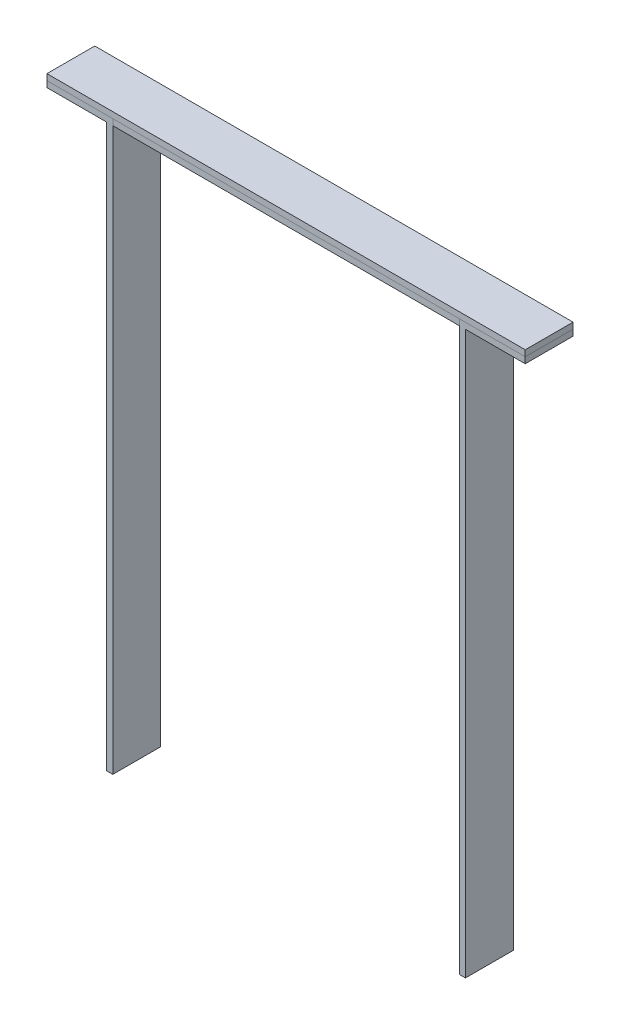
ISO-10303-21;
HEADER;
FILE_DESCRIPTION(('STEP AP214'),'2;1');
FILE_NAME('part.step','',(''),(''),'','','');
FILE_SCHEMA(('AUTOMOTIVE_DESIGN { 1 0 10303 214 1 1 1 1 }'));
ENDSEC;
DATA;
#1=APPLICATION_CONTEXT('core data for automotive mechanical design processes');
#2=APPLICATION_PROTOCOL_DEFINITION('international standard','automotive_design',2000,#1);
#3=PRODUCT_CONTEXT('',#1,'mechanical');
#4=PRODUCT('Part','Part','',(#3));
#5=PRODUCT_RELATED_PRODUCT_CATEGORY('part','',(#4));
#6=PRODUCT_DEFINITION_FORMATION('','',#4);
#7=PRODUCT_DEFINITION_CONTEXT('part definition',#1,'design');
#8=PRODUCT_DEFINITION('design','',#6,#7);
#9=PRODUCT_DEFINITION_SHAPE('','',#8);
#10=(LENGTH_UNIT() NAMED_UNIT(*) SI_UNIT(.MILLI.,.METRE.));
#11=(NAMED_UNIT(*) PLANE_ANGLE_UNIT() SI_UNIT($,.RADIAN.));
#12=(NAMED_UNIT(*) SI_UNIT($,.STERADIAN.) SOLID_ANGLE_UNIT());
#13=UNCERTAINTY_MEASURE_WITH_UNIT(LENGTH_MEASURE(1.E-05),#10,'distance_accuracy_value','');
#14=(GEOMETRIC_REPRESENTATION_CONTEXT(3) GLOBAL_UNCERTAINTY_ASSIGNED_CONTEXT((#13)) GLOBAL_UNIT_ASSIGNED_CONTEXT((#10,
#11,#12)) REPRESENTATION_CONTEXT('',''));
#15=CARTESIAN_POINT('',(0.,0.,0.));
#16=DIRECTION('',(0.,0.,1.));
#17=DIRECTION('',(1.,0.,0.));
#18=AXIS2_PLACEMENT_3D('',#15,#16,#17);
#19=CARTESIAN_POINT('',(0.,118.73,10.));
#20=DIRECTION('',(0.,-1.,0.));
#21=DIRECTION('',(0.,0.,-1.));
#22=AXIS2_PLACEMENT_3D('',#19,#20,#21);
#23=PLANE('',#22);
#24=DIRECTION('',(-1.,0.,0.));
#25=VECTOR('',#24,1.);
#26=CARTESIAN_POINT('',(0.,118.73,0.));
#27=LINE('',#26,#25);
#28=CARTESIAN_POINT('',(87.5,118.73,0.));
#29=VERTEX_POINT('',#28);
#30=CARTESIAN_POINT('',(-12.5,118.73,0.));
#31=VERTEX_POINT('',#30);
#32=EDGE_CURVE('E113',#29,#31,#27,.T.);
#33=ORIENTED_EDGE('',*,*,#32,.F.);
#34=DIRECTION('',(0.,0.,-1.));
#35=VECTOR('',#34,1.);
#36=CARTESIAN_POINT('',(87.5,118.73,10.));
#37=LINE('',#36,#35);
#38=CARTESIAN_POINT('',(87.5,118.73,10.));
#39=VERTEX_POINT('',#38);
#40=EDGE_CURVE('E12',#39,#29,#37,.T.);
#41=ORIENTED_EDGE('',*,*,#40,.F.);
#42=DIRECTION('',(-1.,0.,0.));
#43=VECTOR('',#42,1.);
#44=CARTESIAN_POINT('',(0.,118.73,10.));
#45=LINE('',#44,#43);
#46=CARTESIAN_POINT('',(-12.5,118.73,10.));
#47=VERTEX_POINT('',#46);
#48=EDGE_CURVE('E105',#39,#47,#45,.T.);
#49=ORIENTED_EDGE('',*,*,#48,.T.);
#50=DIRECTION('',(0.,0.,-1.));
#51=VECTOR('',#50,1.);
#52=CARTESIAN_POINT('',(-12.5,118.73,10.));
#53=LINE('',#52,#51);
#54=EDGE_CURVE('E66',#47,#31,#53,.T.);
#55=ORIENTED_EDGE('',*,*,#54,.T.);
#56=EDGE_LOOP('',(#33,#41,#49,#55));
#57=FACE_BOUND('',#56,.T.);
#58=ADVANCED_FACE('F50',(#57),#23,.T.);
#59=CARTESIAN_POINT('',(87.5,0.,10.));
#60=DIRECTION('',(1.,0.,0.));
#61=DIRECTION('',(0.,0.,-1.));
#62=AXIS2_PLACEMENT_3D('',#59,#60,#61);
#63=PLANE('',#62);
#64=DIRECTION('',(0.,-1.,0.));
#65=VECTOR('',#64,1.);
#66=CARTESIAN_POINT('',(87.5,0.,0.));
#67=LINE('',#66,#65);
#68=CARTESIAN_POINT('',(87.5,120.,0.));
#69=VERTEX_POINT('',#68);
#70=EDGE_CURVE('E96',#69,#29,#67,.T.);
#71=ORIENTED_EDGE('',*,*,#70,.F.);
#72=DIRECTION('',(0.,0.,-1.));
#73=VECTOR('',#72,1.);
#74=CARTESIAN_POINT('',(87.5,120.,10.));
#75=LINE('',#74,#73);
#76=CARTESIAN_POINT('',(87.5,120.,10.));
#77=VERTEX_POINT('',#76);
#78=EDGE_CURVE('E58',#77,#69,#75,.T.);
#79=ORIENTED_EDGE('',*,*,#78,.F.);
#80=DIRECTION('',(0.,-1.,0.));
#81=VECTOR('',#80,1.);
#82=CARTESIAN_POINT('',(87.5,0.,10.));
#83=LINE('',#82,#81);
#84=EDGE_CURVE('E94',#77,#39,#83,.T.);
#85=ORIENTED_EDGE('',*,*,#84,.T.);
#86=ORIENTED_EDGE('',*,*,#40,.T.);
#87=EDGE_LOOP('',(#71,#79,#85,#86));
#88=FACE_BOUND('',#87,.T.);
#89=ADVANCED_FACE('F93',(#88),#63,.T.);
#90=CARTESIAN_POINT('',(0.,120.,10.));
#91=DIRECTION('',(0.,1.,0.));
#92=DIRECTION('',(0.,0.,1.));
#93=AXIS2_PLACEMENT_3D('',#90,#91,#92);
#94=PLANE('',#93);
#95=DIRECTION('',(1.,0.,0.));
#96=VECTOR('',#95,1.);
#97=CARTESIAN_POINT('',(0.,120.,0.));
#98=LINE('',#97,#96);
#99=CARTESIAN_POINT('',(-12.5,120.,0.));
#100=VERTEX_POINT('',#99);
#101=EDGE_CURVE('E116',#100,#69,#98,.T.);
#102=ORIENTED_EDGE('',*,*,#101,.F.);
#103=DIRECTION('',(0.,0.,-1.));
#104=VECTOR('',#103,1.);
#105=CARTESIAN_POINT('',(-12.5,120.,10.));
#106=LINE('',#105,#104);
#107=CARTESIAN_POINT('',(-12.5,120.,10.));
#108=VERTEX_POINT('',#107);
#109=EDGE_CURVE('E79',#108,#100,#106,.T.);
#110=ORIENTED_EDGE('',*,*,#109,.F.);
#111=DIRECTION('',(1.,0.,0.));
#112=VECTOR('',#111,1.);
#113=CARTESIAN_POINT('',(0.,120.,10.));
#114=LINE('',#113,#112);
#115=EDGE_CURVE('E104',#108,#77,#114,.T.);
#116=ORIENTED_EDGE('',*,*,#115,.T.);
#117=ORIENTED_EDGE('',*,*,#78,.T.);
#118=EDGE_LOOP('',(#102,#110,#116,#117));
#119=FACE_BOUND('',#118,.T.);
#120=ADVANCED_FACE('F107',(#119),#94,.T.);
#121=CARTESIAN_POINT('',(-12.5,0.,10.));
#122=DIRECTION('',(-1.,0.,0.));
#123=DIRECTION('',(0.,0.,1.));
#124=AXIS2_PLACEMENT_3D('',#121,#122,#123);
#125=PLANE('',#124);
#126=DIRECTION('',(0.,1.,0.));
#127=VECTOR('',#126,1.);
#128=CARTESIAN_POINT('',(-12.5,0.,0.));
#129=LINE('',#128,#127);
#130=EDGE_CURVE('E118',#31,#100,#129,.T.);
#131=ORIENTED_EDGE('',*,*,#130,.F.);
#132=ORIENTED_EDGE('',*,*,#54,.F.);
#133=DIRECTION('',(0.,1.,0.));
#134=VECTOR('',#133,1.);
#135=CARTESIAN_POINT('',(-12.5,0.,10.));
#136=LINE('',#135,#134);
#137=EDGE_CURVE('E108',#47,#108,#136,.T.);
#138=ORIENTED_EDGE('',*,*,#137,.T.);
#139=ORIENTED_EDGE('',*,*,#109,.T.);
#140=EDGE_LOOP('',(#131,#132,#138,#139));
#141=FACE_BOUND('',#140,.T.);
#142=ADVANCED_FACE('F123',(#141),#125,.T.);
#143=CARTESIAN_POINT('',(0.,0.,10.));
#144=DIRECTION('',(0.,0.,1.));
#145=DIRECTION('',(1.,0.,0.));
#146=AXIS2_PLACEMENT_3D('',#143,#144,#145);
#147=PLANE('',#146);
#148=ORIENTED_EDGE('',*,*,#48,.F.);
#149=ORIENTED_EDGE('',*,*,#84,.F.);
#150=ORIENTED_EDGE('',*,*,#115,.F.);
#151=ORIENTED_EDGE('',*,*,#137,.F.);
#152=EDGE_LOOP('',(#148,#149,#150,#151));
#153=FACE_BOUND('',#152,.T.);
#154=ADVANCED_FACE('F102',(#153),#147,.T.);
#155=CARTESIAN_POINT('',(0.,0.,0.));
#156=DIRECTION('',(0.,0.,1.));
#157=DIRECTION('',(1.,0.,0.));
#158=AXIS2_PLACEMENT_3D('',#155,#156,#157);
#159=PLANE('',#158);
#160=ORIENTED_EDGE('',*,*,#32,.T.);
#161=ORIENTED_EDGE('',*,*,#130,.T.);
#162=ORIENTED_EDGE('',*,*,#101,.T.);
#163=ORIENTED_EDGE('',*,*,#70,.T.);
#164=EDGE_LOOP('',(#160,#161,#162,#163));
#165=FACE_BOUND('',#164,.T.);
#166=ADVANCED_FACE('F130',(#165),#159,.F.);
#167=CLOSED_SHELL('',(#58,#89,#120,#142,#154,#166));
#168=MANIFOLD_SOLID_BREP('B2',#167);
#169=CARTESIAN_POINT('',(1.27,0.,10.));
#170=DIRECTION('',(1.,0.,0.));
#171=DIRECTION('',(0.,1.,0.));
#172=AXIS2_PLACEMENT_3D('',#169,#170,#171);
#173=PLANE('',#172);
#174=DIRECTION('',(0.,-1.,0.));
#175=VECTOR('',#174,1.);
#176=CARTESIAN_POINT('',(1.27,0.,0.));
#177=LINE('',#176,#175);
#178=CARTESIAN_POINT('',(1.26999999999999,118.73,0.));
#179=VERTEX_POINT('',#178);
#180=CARTESIAN_POINT('',(1.26999999999999,117.46,0.));
#181=VERTEX_POINT('',#180);
#182=EDGE_CURVE('E256',#179,#181,#177,.T.);
#183=ORIENTED_EDGE('',*,*,#182,.T.);
#184=DIRECTION('',(0.,0.,-1.));
#185=VECTOR('',#184,1.);
#186=CARTESIAN_POINT('',(1.26999999999999,117.46,10.));
#187=LINE('',#186,#185);
#188=CARTESIAN_POINT('',(1.26999999999999,117.46,10.));
#189=VERTEX_POINT('',#188);
#190=EDGE_CURVE('E48',#189,#181,#187,.T.);
#191=ORIENTED_EDGE('',*,*,#190,.F.);
#192=DIRECTION('',(0.,-1.,0.));
#193=VECTOR('',#192,1.);
#194=CARTESIAN_POINT('',(1.27,0.,10.));
#195=LINE('',#194,#193);
#196=CARTESIAN_POINT('',(1.26999999999999,118.73,10.));
#197=VERTEX_POINT('',#196);
#198=EDGE_CURVE('E244',#197,#189,#195,.T.);
#199=ORIENTED_EDGE('',*,*,#198,.F.);
#200=DIRECTION('',(0.,0.,-1.));
#201=VECTOR('',#200,1.);
#202=CARTESIAN_POINT('',(1.26999999999999,118.73,10.));
#203=LINE('',#202,#201);
#204=EDGE_CURVE('E252',#197,#179,#203,.T.);
#205=ORIENTED_EDGE('',*,*,#204,.T.);
#206=EDGE_LOOP('',(#183,#191,#199,#205));
#207=FACE_BOUND('',#206,.T.);
#208=ADVANCED_FACE('F193',(#207),#173,.F.);
#209=CARTESIAN_POINT('',(0.,117.46,10.));
#210=DIRECTION('',(0.,1.,0.));
#211=DIRECTION('',(0.,0.,1.));
#212=AXIS2_PLACEMENT_3D('',#209,#210,#211);
#213=PLANE('',#212);
#214=DIRECTION('',(1.,0.,0.));
#215=VECTOR('',#214,1.);
#216=CARTESIAN_POINT('',(0.,117.46,0.));
#217=LINE('',#216,#215);
#218=CARTESIAN_POINT('',(73.73,117.46,0.));
#219=VERTEX_POINT('',#218);
#220=EDGE_CURVE('E248',#181,#219,#217,.T.);
#221=ORIENTED_EDGE('',*,*,#220,.T.);
#222=DIRECTION('',(0.,0.,-1.));
#223=VECTOR('',#222,1.);
#224=CARTESIAN_POINT('',(73.73,117.46,10.));
#225=LINE('',#224,#223);
#226=CARTESIAN_POINT('',(73.73,117.46,10.));
#227=VERTEX_POINT('',#226);
#228=EDGE_CURVE('E201',#227,#219,#225,.T.);
#229=ORIENTED_EDGE('',*,*,#228,.F.);
#230=DIRECTION('',(1.,0.,0.));
#231=VECTOR('',#230,1.);
#232=CARTESIAN_POINT('',(0.,117.46,10.));
#233=LINE('',#232,#231);
#234=EDGE_CURVE('E239',#189,#227,#233,.T.);
#235=ORIENTED_EDGE('',*,*,#234,.F.);
#236=ORIENTED_EDGE('',*,*,#190,.T.);
#237=EDGE_LOOP('',(#221,#229,#235,#236));
#238=FACE_BOUND('',#237,.T.);
#239=ADVANCED_FACE('F247',(#238),#213,.F.);
#240=CARTESIAN_POINT('',(73.73,0.,10.));
#241=DIRECTION('',(-1.,0.,0.));
#242=DIRECTION('',(0.,-1.,0.));
#243=AXIS2_PLACEMENT_3D('',#240,#241,#242);
#244=PLANE('',#243);
#245=DIRECTION('',(0.,1.,0.));
#246=VECTOR('',#245,1.);
#247=CARTESIAN_POINT('',(73.73,0.,0.));
#248=LINE('',#247,#246);
#249=CARTESIAN_POINT('',(73.73,118.73,0.));
#250=VERTEX_POINT('',#249);
#251=EDGE_CURVE('E226',#219,#250,#248,.T.);
#252=ORIENTED_EDGE('',*,*,#251,.T.);
#253=DIRECTION('',(0.,0.,-1.));
#254=VECTOR('',#253,1.);
#255=CARTESIAN_POINT('',(73.73,118.73,10.));
#256=LINE('',#255,#254);
#257=CARTESIAN_POINT('',(73.73,118.73,10.));
#258=VERTEX_POINT('',#257);
#259=EDGE_CURVE('E249',#258,#250,#256,.T.);
#260=ORIENTED_EDGE('',*,*,#259,.F.);
#261=DIRECTION('',(0.,1.,0.));
#262=VECTOR('',#261,1.);
#263=CARTESIAN_POINT('',(73.73,0.,10.));
#264=LINE('',#263,#262);
#265=EDGE_CURVE('E242',#227,#258,#264,.T.);
#266=ORIENTED_EDGE('',*,*,#265,.F.);
#267=ORIENTED_EDGE('',*,*,#228,.T.);
#268=EDGE_LOOP('',(#252,#260,#266,#267));
#269=FACE_BOUND('',#268,.T.);
#270=ADVANCED_FACE('F250',(#269),#244,.F.);
#271=CARTESIAN_POINT('',(0.,118.73,10.));
#272=DIRECTION('',(0.,-1.,0.));
#273=DIRECTION('',(0.,0.,-1.));
#274=AXIS2_PLACEMENT_3D('',#271,#272,#273);
#275=PLANE('',#274);
#276=DIRECTION('',(-1.,0.,0.));
#277=VECTOR('',#276,1.);
#278=CARTESIAN_POINT('',(0.,118.73,0.));
#279=LINE('',#278,#277);
#280=EDGE_CURVE('E232',#250,#179,#279,.T.);
#281=ORIENTED_EDGE('',*,*,#280,.T.);
#282=ORIENTED_EDGE('',*,*,#204,.F.);
#283=DIRECTION('',(-1.,0.,0.));
#284=VECTOR('',#283,1.);
#285=CARTESIAN_POINT('',(0.,118.73,10.));
#286=LINE('',#285,#284);
#287=EDGE_CURVE('E209',#258,#197,#286,.T.);
#288=ORIENTED_EDGE('',*,*,#287,.F.);
#289=ORIENTED_EDGE('',*,*,#259,.T.);
#290=EDGE_LOOP('',(#281,#282,#288,#289));
#291=FACE_BOUND('',#290,.T.);
#292=ADVANCED_FACE('F263',(#291),#275,.F.);
#293=CARTESIAN_POINT('',(0.,0.,10.));
#294=DIRECTION('',(0.,0.,1.));
#295=DIRECTION('',(1.,0.,0.));
#296=AXIS2_PLACEMENT_3D('',#293,#294,#295);
#297=PLANE('',#296);
#298=ORIENTED_EDGE('',*,*,#198,.T.);
#299=ORIENTED_EDGE('',*,*,#234,.T.);
#300=ORIENTED_EDGE('',*,*,#265,.T.);
#301=ORIENTED_EDGE('',*,*,#287,.T.);
#302=EDGE_LOOP('',(#298,#299,#300,#301));
#303=FACE_BOUND('',#302,.T.);
#304=ADVANCED_FACE('F240',(#303),#297,.T.);
#305=CARTESIAN_POINT('',(0.,0.,0.));
#306=DIRECTION('',(0.,0.,1.));
#307=DIRECTION('',(1.,0.,0.));
#308=AXIS2_PLACEMENT_3D('',#305,#306,#307);
#309=PLANE('',#308);
#310=ORIENTED_EDGE('',*,*,#182,.F.);
#311=ORIENTED_EDGE('',*,*,#280,.F.);
#312=ORIENTED_EDGE('',*,*,#251,.F.);
#313=ORIENTED_EDGE('',*,*,#220,.F.);
#314=EDGE_LOOP('',(#310,#311,#312,#313));
#315=FACE_BOUND('',#314,.T.);
#316=ADVANCED_FACE('F266',(#315),#309,.F.);
#317=CLOSED_SHELL('',(#208,#239,#270,#292,#304,#316));
#318=MANIFOLD_SOLID_BREP('B6',#317);
#319=CARTESIAN_POINT('',(73.73,0.,10.));
#320=DIRECTION('',(-1.,0.,0.));
#321=DIRECTION('',(0.,-1.,0.));
#322=AXIS2_PLACEMENT_3D('',#319,#320,#321);
#323=PLANE('',#322);
#324=DIRECTION('',(0.,1.,0.));
#325=VECTOR('',#324,1.);
#326=CARTESIAN_POINT('',(73.73,0.,0.));
#327=LINE('',#326,#325);
#328=CARTESIAN_POINT('',(73.73,0.,0.));
#329=VERTEX_POINT('',#328);
#330=CARTESIAN_POINT('',(73.73,118.73,0.));
#331=VERTEX_POINT('',#330);
#332=EDGE_CURVE('E416',#329,#331,#327,.T.);
#333=ORIENTED_EDGE('',*,*,#332,.F.);
#334=DIRECTION('',(0.,0.,-1.));
#335=VECTOR('',#334,1.);
#336=CARTESIAN_POINT('',(73.73,0.,10.));
#337=LINE('',#336,#335);
#338=CARTESIAN_POINT('',(73.73,0.,10.));
#339=VERTEX_POINT('',#338);
#340=EDGE_CURVE('E191',#339,#329,#337,.T.);
#341=ORIENTED_EDGE('',*,*,#340,.F.);
#342=DIRECTION('',(0.,1.,0.));
#343=VECTOR('',#342,1.);
#344=CARTESIAN_POINT('',(73.73,0.,10.));
#345=LINE('',#344,#343);
#346=CARTESIAN_POINT('',(73.73,118.73,10.));
#347=VERTEX_POINT('',#346);
#348=EDGE_CURVE('E430',#339,#347,#345,.T.);
#349=ORIENTED_EDGE('',*,*,#348,.T.);
#350=DIRECTION('',(0.,0.,-1.));
#351=VECTOR('',#350,1.);
#352=CARTESIAN_POINT('',(73.73,118.73,10.));
#353=LINE('',#352,#351);
#354=EDGE_CURVE('E379',#347,#331,#353,.T.);
#355=ORIENTED_EDGE('',*,*,#354,.T.);
#356=EDGE_LOOP('',(#333,#341,#349,#355));
#357=FACE_BOUND('',#356,.T.);
#358=ADVANCED_FACE('F335',(#357),#323,.T.);
#359=CARTESIAN_POINT('',(0.,-1.9080239131939E-13,10.));
#360=DIRECTION('',(0.,-1.,0.));
#361=DIRECTION('',(1.,0.,0.));
#362=AXIS2_PLACEMENT_3D('',#359,#360,#361);
#363=PLANE('',#362);
#364=DIRECTION('',(-1.,0.,0.));
#365=VECTOR('',#364,1.);
#366=CARTESIAN_POINT('',(0.,-1.9080239131939E-13,0.));
#367=LINE('',#366,#365);
#368=CARTESIAN_POINT('',(75.,0.,0.));
#369=VERTEX_POINT('',#368);
#370=EDGE_CURVE('E419',#369,#329,#367,.T.);
#371=ORIENTED_EDGE('',*,*,#370,.F.);
#372=DIRECTION('',(0.,0.,-1.));
#373=VECTOR('',#372,1.);
#374=CARTESIAN_POINT('',(75.,0.,10.));
#375=LINE('',#374,#373);
#376=CARTESIAN_POINT('',(75.,0.,10.));
#377=VERTEX_POINT('',#376);
#378=EDGE_CURVE('E343',#377,#369,#375,.T.);
#379=ORIENTED_EDGE('',*,*,#378,.F.);
#380=DIRECTION('',(-1.,0.,0.));
#381=VECTOR('',#380,1.);
#382=CARTESIAN_POINT('',(0.,-1.9080239131939E-13,10.));
#383=LINE('',#382,#381);
#384=EDGE_CURVE('E443',#377,#339,#383,.T.);
#385=ORIENTED_EDGE('',*,*,#384,.T.);
#386=ORIENTED_EDGE('',*,*,#340,.T.);
#387=EDGE_LOOP('',(#371,#379,#385,#386));
#388=FACE_BOUND('',#387,.T.);
#389=ADVANCED_FACE('F439',(#388),#363,.T.);
#390=CARTESIAN_POINT('',(75.,0.,10.));
#391=DIRECTION('',(1.,0.,0.));
#392=DIRECTION('',(0.,1.,0.));
#393=AXIS2_PLACEMENT_3D('',#390,#391,#392);
#394=PLANE('',#393);
#395=DIRECTION('',(0.,-1.,0.));
#396=VECTOR('',#395,1.);
#397=CARTESIAN_POINT('',(75.,0.,0.));
#398=LINE('',#397,#396);
#399=CARTESIAN_POINT('',(75.,117.46,0.));
#400=VERTEX_POINT('',#399);
#401=EDGE_CURVE('E422',#400,#369,#398,.T.);
#402=ORIENTED_EDGE('',*,*,#401,.F.);
#403=DIRECTION('',(0.,0.,-1.));
#404=VECTOR('',#403,1.);
#405=CARTESIAN_POINT('',(75.,117.46,10.));
#406=LINE('',#405,#404);
#407=CARTESIAN_POINT('',(75.,117.46,10.));
#408=VERTEX_POINT('',#407);
#409=EDGE_CURVE('E402',#408,#400,#406,.T.);
#410=ORIENTED_EDGE('',*,*,#409,.F.);
#411=DIRECTION('',(0.,-1.,0.));
#412=VECTOR('',#411,1.);
#413=CARTESIAN_POINT('',(75.,0.,10.));
#414=LINE('',#413,#412);
#415=EDGE_CURVE('E409',#408,#377,#414,.T.);
#416=ORIENTED_EDGE('',*,*,#415,.T.);
#417=ORIENTED_EDGE('',*,*,#378,.T.);
#418=EDGE_LOOP('',(#402,#410,#416,#417));
#419=FACE_BOUND('',#418,.T.);
#420=ADVANCED_FACE('F436',(#419),#394,.T.);
#421=CARTESIAN_POINT('',(0.,117.46,10.));
#422=DIRECTION('',(0.,-1.,0.));
#423=DIRECTION('',(0.,0.,-1.));
#424=AXIS2_PLACEMENT_3D('',#421,#422,#423);
#425=PLANE('',#424);
#426=DIRECTION('',(-1.,0.,0.));
#427=VECTOR('',#426,1.);
#428=CARTESIAN_POINT('',(0.,117.46,0.));
#429=LINE('',#428,#427);
#430=CARTESIAN_POINT('',(87.5,117.46,0.));
#431=VERTEX_POINT('',#430);
#432=EDGE_CURVE('E397',#431,#400,#429,.T.);
#433=ORIENTED_EDGE('',*,*,#432,.F.);
#434=DIRECTION('',(0.,0.,-1.));
#435=VECTOR('',#434,1.);
#436=CARTESIAN_POINT('',(87.5,117.46,10.));
#437=LINE('',#436,#435);
#438=CARTESIAN_POINT('',(87.5,117.46,10.));
#439=VERTEX_POINT('',#438);
#440=EDGE_CURVE('E392',#439,#431,#437,.T.);
#441=ORIENTED_EDGE('',*,*,#440,.F.);
#442=DIRECTION('',(-1.,0.,0.));
#443=VECTOR('',#442,1.);
#444=CARTESIAN_POINT('',(0.,117.46,10.));
#445=LINE('',#444,#443);
#446=EDGE_CURVE('E395',#439,#408,#445,.T.);
#447=ORIENTED_EDGE('',*,*,#446,.T.);
#448=ORIENTED_EDGE('',*,*,#409,.T.);
#449=EDGE_LOOP('',(#433,#441,#447,#448));
#450=FACE_BOUND('',#449,.T.);
#451=ADVANCED_FACE('F394',(#450),#425,.T.);
#452=CARTESIAN_POINT('',(87.5000000000013,9.56146797782511E-13,10.));
#453=DIRECTION('',(1.,0.,0.));
#454=DIRECTION('',(0.,1.,0.));
#455=AXIS2_PLACEMENT_3D('',#452,#453,#454);
#456=PLANE('',#455);
#457=DIRECTION('',(0.,-1.,0.));
#458=VECTOR('',#457,1.);
#459=CARTESIAN_POINT('',(87.5000000000013,9.56146797782511E-13,0.));
#460=LINE('',#459,#458);
#461=CARTESIAN_POINT('',(87.5,118.73,0.));
#462=VERTEX_POINT('',#461);
#463=EDGE_CURVE('E426',#462,#431,#460,.T.);
#464=ORIENTED_EDGE('',*,*,#463,.F.);
#465=DIRECTION('',(0.,0.,-1.));
#466=VECTOR('',#465,1.);
#467=CARTESIAN_POINT('',(87.5,118.73,10.));
#468=LINE('',#467,#466);
#469=CARTESIAN_POINT('',(87.5,118.73,10.));
#470=VERTEX_POINT('',#469);
#471=EDGE_CURVE('E372',#470,#462,#468,.T.);
#472=ORIENTED_EDGE('',*,*,#471,.F.);
#473=DIRECTION('',(0.,-1.,0.));
#474=VECTOR('',#473,1.);
#475=CARTESIAN_POINT('',(87.5000000000013,9.56146797782511E-13,10.));
#476=LINE('',#475,#474);
#477=EDGE_CURVE('E406',#470,#439,#476,.T.);
#478=ORIENTED_EDGE('',*,*,#477,.T.);
#479=ORIENTED_EDGE('',*,*,#440,.T.);
#480=EDGE_LOOP('',(#464,#472,#478,#479));
#481=FACE_BOUND('',#480,.T.);
#482=ADVANCED_FACE('F411',(#481),#456,.T.);
#483=CARTESIAN_POINT('',(0.,118.73,10.));
#484=DIRECTION('',(0.,-1.,0.));
#485=DIRECTION('',(0.,0.,-1.));
#486=AXIS2_PLACEMENT_3D('',#483,#484,#485);
#487=PLANE('',#486);
#488=DIRECTION('',(-1.,0.,0.));
#489=VECTOR('',#488,1.);
#490=CARTESIAN_POINT('',(0.,118.73,0.));
#491=LINE('',#490,#489);
#492=EDGE_CURVE('E428',#462,#331,#491,.T.);
#493=ORIENTED_EDGE('',*,*,#492,.T.);
#494=ORIENTED_EDGE('',*,*,#354,.F.);
#495=DIRECTION('',(-1.,0.,0.));
#496=VECTOR('',#495,1.);
#497=CARTESIAN_POINT('',(0.,118.73,10.));
#498=LINE('',#497,#496);
#499=EDGE_CURVE('E351',#470,#347,#498,.T.);
#500=ORIENTED_EDGE('',*,*,#499,.F.);
#501=ORIENTED_EDGE('',*,*,#471,.T.);
#502=EDGE_LOOP('',(#493,#494,#500,#501));
#503=FACE_BOUND('',#502,.T.);
#504=ADVANCED_FACE('F442',(#503),#487,.F.);
#505=CARTESIAN_POINT('',(0.,0.,10.));
#506=DIRECTION('',(0.,0.,1.));
#507=DIRECTION('',(1.,0.,0.));
#508=AXIS2_PLACEMENT_3D('',#505,#506,#507);
#509=PLANE('',#508);
#510=ORIENTED_EDGE('',*,*,#348,.F.);
#511=ORIENTED_EDGE('',*,*,#384,.F.);
#512=ORIENTED_EDGE('',*,*,#415,.F.);
#513=ORIENTED_EDGE('',*,*,#446,.F.);
#514=ORIENTED_EDGE('',*,*,#477,.F.);
#515=ORIENTED_EDGE('',*,*,#499,.T.);
#516=EDGE_LOOP('',(#510,#511,#512,#513,#514,#515));
#517=FACE_BOUND('',#516,.T.);
#518=ADVANCED_FACE('F405',(#517),#509,.T.);
#519=CARTESIAN_POINT('',(0.,0.,0.));
#520=DIRECTION('',(0.,0.,1.));
#521=DIRECTION('',(1.,0.,0.));
#522=AXIS2_PLACEMENT_3D('',#519,#520,#521);
#523=PLANE('',#522);
#524=ORIENTED_EDGE('',*,*,#332,.T.);
#525=ORIENTED_EDGE('',*,*,#492,.F.);
#526=ORIENTED_EDGE('',*,*,#463,.T.);
#527=ORIENTED_EDGE('',*,*,#432,.T.);
#528=ORIENTED_EDGE('',*,*,#401,.T.);
#529=ORIENTED_EDGE('',*,*,#370,.T.);
#530=EDGE_LOOP('',(#524,#525,#526,#527,#528,#529));
#531=FACE_BOUND('',#530,.T.);
#532=ADVANCED_FACE('F441',(#531),#523,.F.);
#533=CLOSED_SHELL('',(#358,#389,#420,#451,#482,#504,#518,#532));
#534=MANIFOLD_SOLID_BREP('B42',#533);
#535=CARTESIAN_POINT('',(0.,0.,10.));
#536=DIRECTION('',(0.,-1.,0.));
#537=DIRECTION('',(1.,0.,0.));
#538=AXIS2_PLACEMENT_3D('',#535,#536,#537);
#539=PLANE('',#538);
#540=DIRECTION('',(-1.,0.,0.));
#541=VECTOR('',#540,1.);
#542=CARTESIAN_POINT('',(0.,0.,0.));
#543=LINE('',#542,#541);
#544=CARTESIAN_POINT('',(1.27,0.,0.));
#545=VERTEX_POINT('',#544);
#546=CARTESIAN_POINT('',(0.,0.,0.));
#547=VERTEX_POINT('',#546);
#548=EDGE_CURVE('E598',#545,#547,#543,.T.);
#549=ORIENTED_EDGE('',*,*,#548,.F.);
#550=DIRECTION('',(0.,0.,-1.));
#551=VECTOR('',#550,1.);
#552=CARTESIAN_POINT('',(1.27,0.,10.));
#553=LINE('',#552,#551);
#554=CARTESIAN_POINT('',(1.27,0.,10.));
#555=VERTEX_POINT('',#554);
#556=EDGE_CURVE('E333',#555,#545,#553,.T.);
#557=ORIENTED_EDGE('',*,*,#556,.F.);
#558=DIRECTION('',(-1.,0.,0.));
#559=VECTOR('',#558,1.);
#560=CARTESIAN_POINT('',(0.,0.,10.));
#561=LINE('',#560,#559);
#562=CARTESIAN_POINT('',(0.,0.,10.));
#563=VERTEX_POINT('',#562);
#564=EDGE_CURVE('E612',#555,#563,#561,.T.);
#565=ORIENTED_EDGE('',*,*,#564,.T.);
#566=DIRECTION('',(0.,0.,-1.));
#567=VECTOR('',#566,1.);
#568=CARTESIAN_POINT('',(0.,0.,10.));
#569=LINE('',#568,#567);
#570=EDGE_CURVE('E533',#563,#547,#569,.T.);
#571=ORIENTED_EDGE('',*,*,#570,.T.);
#572=EDGE_LOOP('',(#549,#557,#565,#571));
#573=FACE_BOUND('',#572,.T.);
#574=ADVANCED_FACE('F517',(#573),#539,.T.);
#575=CARTESIAN_POINT('',(1.27,0.,10.));
#576=DIRECTION('',(1.,0.,0.));
#577=DIRECTION('',(0.,1.,0.));
#578=AXIS2_PLACEMENT_3D('',#575,#576,#577);
#579=PLANE('',#578);
#580=DIRECTION('',(0.,-1.,0.));
#581=VECTOR('',#580,1.);
#582=CARTESIAN_POINT('',(1.27,0.,0.));
#583=LINE('',#582,#581);
#584=CARTESIAN_POINT('',(1.26999999999999,118.73,0.));
#585=VERTEX_POINT('',#584);
#586=EDGE_CURVE('E600',#585,#545,#583,.T.);
#587=ORIENTED_EDGE('',*,*,#586,.F.);
#588=DIRECTION('',(0.,0.,-1.));
#589=VECTOR('',#588,1.);
#590=CARTESIAN_POINT('',(1.26999999999999,118.73,10.));
#591=LINE('',#590,#589);
#592=CARTESIAN_POINT('',(1.26999999999999,118.73,10.));
#593=VERTEX_POINT('',#592);
#594=EDGE_CURVE('E525',#593,#585,#591,.T.);
#595=ORIENTED_EDGE('',*,*,#594,.F.);
#596=DIRECTION('',(0.,-1.,0.));
#597=VECTOR('',#596,1.);
#598=CARTESIAN_POINT('',(1.27,0.,10.));
#599=LINE('',#598,#597);
#600=EDGE_CURVE('E693',#593,#555,#599,.T.);
#601=ORIENTED_EDGE('',*,*,#600,.T.);
#602=ORIENTED_EDGE('',*,*,#556,.T.);
#603=EDGE_LOOP('',(#587,#595,#601,#602));
#604=FACE_BOUND('',#603,.T.);
#605=ADVANCED_FACE('F621',(#604),#579,.T.);
#606=CARTESIAN_POINT('',(0.,118.73,10.));
#607=DIRECTION('',(0.,1.,0.));
#608=DIRECTION('',(0.,0.,1.));
#609=AXIS2_PLACEMENT_3D('',#606,#607,#608);
#610=PLANE('',#609);
#611=DIRECTION('',(1.,0.,0.));
#612=VECTOR('',#611,1.);
#613=CARTESIAN_POINT('',(0.,118.73,0.));
#614=LINE('',#613,#612);
#615=CARTESIAN_POINT('',(-12.5,118.73,0.));
#616=VERTEX_POINT('',#615);
#617=EDGE_CURVE('E603',#616,#585,#614,.T.);
#618=ORIENTED_EDGE('',*,*,#617,.F.);
#619=DIRECTION('',(0.,0.,-1.));
#620=VECTOR('',#619,1.);
#621=CARTESIAN_POINT('',(-12.5,118.73,10.));
#622=LINE('',#621,#620);
#623=CARTESIAN_POINT('',(-12.5,118.73,10.));
#624=VERTEX_POINT('',#623);
#625=EDGE_CURVE('E580',#624,#616,#622,.T.);
#626=ORIENTED_EDGE('',*,*,#625,.F.);
#627=DIRECTION('',(1.,0.,0.));
#628=VECTOR('',#627,1.);
#629=CARTESIAN_POINT('',(0.,118.73,10.));
#630=LINE('',#629,#628);
#631=EDGE_CURVE('E590',#624,#593,#630,.T.);
#632=ORIENTED_EDGE('',*,*,#631,.T.);
#633=ORIENTED_EDGE('',*,*,#594,.T.);
#634=EDGE_LOOP('',(#618,#626,#632,#633));
#635=FACE_BOUND('',#634,.T.);
#636=ADVANCED_FACE('F618',(#635),#610,.T.);
#637=CARTESIAN_POINT('',(-12.4999999999987,-1.365923996832E-13,10.));
#638=DIRECTION('',(-1.,0.,0.));
#639=DIRECTION('',(0.,-1.,0.));
#640=AXIS2_PLACEMENT_3D('',#637,#638,#639);
#641=PLANE('',#640);
#642=DIRECTION('',(0.,1.,0.));
#643=VECTOR('',#642,1.);
#644=CARTESIAN_POINT('',(-12.4999999999987,-1.365923996832E-13,0.));
#645=LINE('',#644,#643);
#646=CARTESIAN_POINT('',(-12.5,117.46,0.));
#647=VERTEX_POINT('',#646);
#648=EDGE_CURVE('E576',#647,#616,#645,.T.);
#649=ORIENTED_EDGE('',*,*,#648,.F.);
#650=DIRECTION('',(0.,0.,-1.));
#651=VECTOR('',#650,1.);
#652=CARTESIAN_POINT('',(-12.5,117.46,10.));
#653=LINE('',#652,#651);
#654=CARTESIAN_POINT('',(-12.5,117.46,10.));
#655=VERTEX_POINT('',#654);
#656=EDGE_CURVE('E571',#655,#647,#653,.T.);
#657=ORIENTED_EDGE('',*,*,#656,.F.);
#658=DIRECTION('',(0.,1.,0.));
#659=VECTOR('',#658,1.);
#660=CARTESIAN_POINT('',(-12.4999999999987,-1.365923996832E-13,10.));
#661=LINE('',#660,#659);
#662=EDGE_CURVE('E574',#655,#624,#661,.T.);
#663=ORIENTED_EDGE('',*,*,#662,.T.);
#664=ORIENTED_EDGE('',*,*,#625,.T.);
#665=EDGE_LOOP('',(#649,#657,#663,#664));
#666=FACE_BOUND('',#665,.T.);
#667=ADVANCED_FACE('F573',(#666),#641,.T.);
#668=CARTESIAN_POINT('',(1.30406796472471E-13,117.46,10.));
#669=DIRECTION('',(0.,-1.,0.));
#670=DIRECTION('',(1.,0.,0.));
#671=AXIS2_PLACEMENT_3D('',#668,#669,#670);
#672=PLANE('',#671);
#673=DIRECTION('',(-1.,0.,0.));
#674=VECTOR('',#673,1.);
#675=CARTESIAN_POINT('',(1.30406796472471E-13,117.46,0.));
#676=LINE('',#675,#674);
#677=CARTESIAN_POINT('',(0.,117.46,0.));
#678=VERTEX_POINT('',#677);
#679=EDGE_CURVE('E607',#678,#647,#676,.T.);
#680=ORIENTED_EDGE('',*,*,#679,.F.);
#681=DIRECTION('',(0.,0.,-1.));
#682=VECTOR('',#681,1.);
#683=CARTESIAN_POINT('',(0.,117.46,10.));
#684=LINE('',#683,#682);
#685=CARTESIAN_POINT('',(0.,117.46,10.));
#686=VERTEX_POINT('',#685);
#687=EDGE_CURVE('E552',#686,#678,#684,.T.);
#688=ORIENTED_EDGE('',*,*,#687,.F.);
#689=DIRECTION('',(-1.,0.,0.));
#690=VECTOR('',#689,1.);
#691=CARTESIAN_POINT('',(1.30406796472471E-13,117.46,10.));
#692=LINE('',#691,#690);
#693=EDGE_CURVE('E587',#686,#655,#692,.T.);
#694=ORIENTED_EDGE('',*,*,#693,.T.);
#695=ORIENTED_EDGE('',*,*,#656,.T.);
#696=EDGE_LOOP('',(#680,#688,#694,#695));
#697=FACE_BOUND('',#696,.T.);
#698=ADVANCED_FACE('F592',(#697),#672,.T.);
#699=CARTESIAN_POINT('',(0.,0.,10.));
#700=DIRECTION('',(-1.,0.,0.));
#701=DIRECTION('',(0.,0.,1.));
#702=AXIS2_PLACEMENT_3D('',#699,#700,#701);
#703=PLANE('',#702);
#704=DIRECTION('',(0.,1.,0.));
#705=VECTOR('',#704,1.);
#706=CARTESIAN_POINT('',(0.,0.,0.));
#707=LINE('',#706,#705);
#708=EDGE_CURVE('E609',#547,#678,#707,.T.);
#709=ORIENTED_EDGE('',*,*,#708,.F.);
#710=ORIENTED_EDGE('',*,*,#570,.F.);
#711=DIRECTION('',(0.,1.,0.));
#712=VECTOR('',#711,1.);
#713=CARTESIAN_POINT('',(0.,0.,10.));
#714=LINE('',#713,#712);
#715=EDGE_CURVE('E593',#563,#686,#714,.T.);
#716=ORIENTED_EDGE('',*,*,#715,.T.);
#717=ORIENTED_EDGE('',*,*,#687,.T.);
#718=EDGE_LOOP('',(#709,#710,#716,#717));
#719=FACE_BOUND('',#718,.T.);
#720=ADVANCED_FACE('F624',(#719),#703,.T.);
#721=CARTESIAN_POINT('',(0.,0.,10.));
#722=DIRECTION('',(0.,0.,1.));
#723=DIRECTION('',(1.,0.,0.));
#724=AXIS2_PLACEMENT_3D('',#721,#722,#723);
#725=PLANE('',#724);
#726=ORIENTED_EDGE('',*,*,#564,.F.);
#727=ORIENTED_EDGE('',*,*,#600,.F.);
#728=ORIENTED_EDGE('',*,*,#631,.F.);
#729=ORIENTED_EDGE('',*,*,#662,.F.);
#730=ORIENTED_EDGE('',*,*,#693,.F.);
#731=ORIENTED_EDGE('',*,*,#715,.F.);
#732=EDGE_LOOP('',(#726,#727,#728,#729,#730,#731));
#733=FACE_BOUND('',#732,.T.);
#734=ADVANCED_FACE('F585',(#733),#725,.T.);
#735=CARTESIAN_POINT('',(0.,0.,0.));
#736=DIRECTION('',(0.,0.,1.));
#737=DIRECTION('',(1.,0.,0.));
#738=AXIS2_PLACEMENT_3D('',#735,#736,#737);
#739=PLANE('',#738);
#740=ORIENTED_EDGE('',*,*,#548,.T.);
#741=ORIENTED_EDGE('',*,*,#708,.T.);
#742=ORIENTED_EDGE('',*,*,#679,.T.);
#743=ORIENTED_EDGE('',*,*,#648,.T.);
#744=ORIENTED_EDGE('',*,*,#617,.T.);
#745=ORIENTED_EDGE('',*,*,#586,.T.);
#746=EDGE_LOOP('',(#740,#741,#742,#743,#744,#745));
#747=FACE_BOUND('',#746,.T.);
#748=ADVANCED_FACE('F623',(#747),#739,.F.);
#749=CLOSED_SHELL('',(#574,#605,#636,#667,#698,#720,#734,#748));
#750=MANIFOLD_SOLID_BREP('B185',#749);
#751=ADVANCED_BREP_SHAPE_REPRESENTATION('',(#18,#168,#318,#534,#750),#14);
#752=SHAPE_DEFINITION_REPRESENTATION(#9,#751);
ENDSEC;
END-ISO-10303-21;
